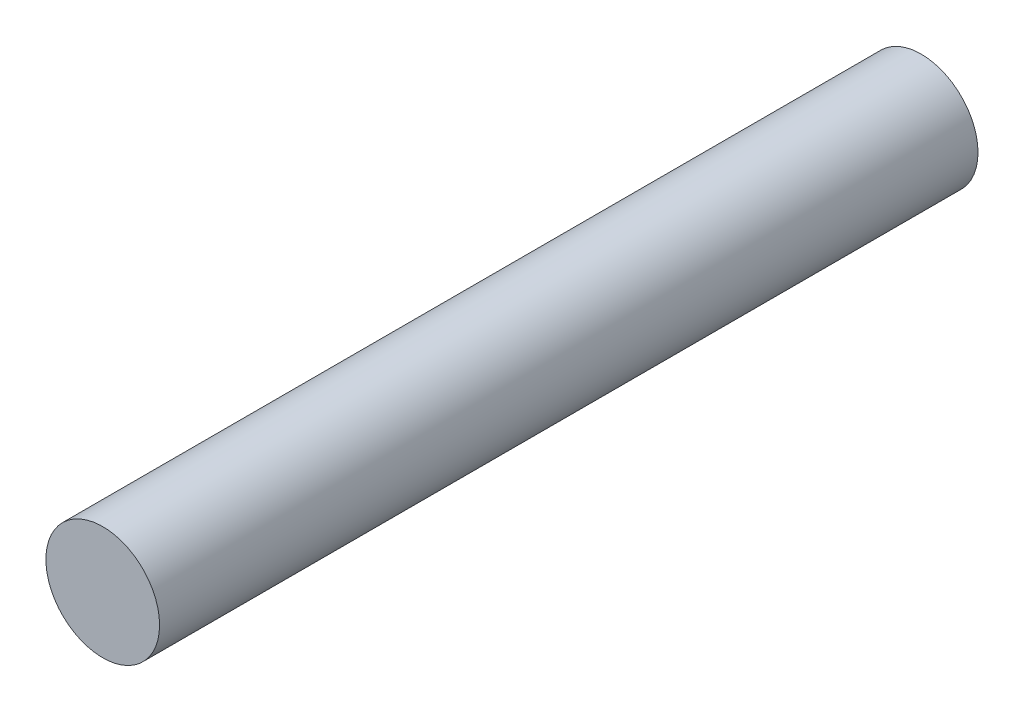
ISO-10303-21;
HEADER;
FILE_DESCRIPTION(('STEP AP214'),'2;1');
FILE_NAME('part.step','',(''),(''),'','','');
FILE_SCHEMA(('AUTOMOTIVE_DESIGN { 1 0 10303 214 1 1 1 1 }'));
ENDSEC;
DATA;
#1=APPLICATION_CONTEXT('core data for automotive mechanical design processes');
#2=APPLICATION_PROTOCOL_DEFINITION('international standard','automotive_design',2000,#1);
#3=PRODUCT_CONTEXT('',#1,'mechanical');
#4=PRODUCT('Part','Part','',(#3));
#5=PRODUCT_RELATED_PRODUCT_CATEGORY('part','',(#4));
#6=PRODUCT_DEFINITION_FORMATION('','',#4);
#7=PRODUCT_DEFINITION_CONTEXT('part definition',#1,'design');
#8=PRODUCT_DEFINITION('design','',#6,#7);
#9=PRODUCT_DEFINITION_SHAPE('','',#8);
#10=(LENGTH_UNIT() NAMED_UNIT(*) SI_UNIT(.MILLI.,.METRE.));
#11=(NAMED_UNIT(*) PLANE_ANGLE_UNIT() SI_UNIT($,.RADIAN.));
#12=(NAMED_UNIT(*) SI_UNIT($,.STERADIAN.) SOLID_ANGLE_UNIT());
#13=UNCERTAINTY_MEASURE_WITH_UNIT(LENGTH_MEASURE(1.E-05),#10,'distance_accuracy_value','');
#14=(GEOMETRIC_REPRESENTATION_CONTEXT(3) GLOBAL_UNCERTAINTY_ASSIGNED_CONTEXT((#13)) GLOBAL_UNIT_ASSIGNED_CONTEXT((#10,
#11,#12)) REPRESENTATION_CONTEXT('',''));
#15=CARTESIAN_POINT('',(0.,0.,0.));
#16=DIRECTION('',(0.,0.,1.));
#17=DIRECTION('',(1.,0.,0.));
#18=AXIS2_PLACEMENT_3D('',#15,#16,#17);
#19=CARTESIAN_POINT('',(0.,0.,72.));
#20=DIRECTION('',(0.,0.,-1.));
#21=DIRECTION('',(-1.,0.,0.));
#22=AXIS2_PLACEMENT_3D('',#19,#20,#21);
#23=CYLINDRICAL_SURFACE('',#22,5.);
#24=CARTESIAN_POINT('',(0.,0.,72.));
#25=DIRECTION('',(0.,0.,1.));
#26=DIRECTION('',(1.,0.,0.));
#27=AXIS2_PLACEMENT_3D('',#24,#25,#26);
#28=CIRCLE('',#27,5.);
#29=CARTESIAN_POINT('',(5.,0.,72.));
#30=VERTEX_POINT('',#29);
#31=EDGE_CURVE('E10',#30,#30,#28,.T.);
#32=ORIENTED_EDGE('',*,*,#31,.F.);
#33=EDGE_LOOP('',(#32));
#34=FACE_BOUND('',#33,.T.);
#35=CARTESIAN_POINT('',(0.,0.,0.));
#36=DIRECTION('',(0.,0.,1.));
#37=DIRECTION('',(1.,0.,0.));
#38=AXIS2_PLACEMENT_3D('',#35,#36,#37);
#39=CIRCLE('',#38,5.);
#40=CARTESIAN_POINT('',(5.,0.,0.));
#41=VERTEX_POINT('',#40);
#42=EDGE_CURVE('E40',#41,#41,#39,.T.);
#43=ORIENTED_EDGE('',*,*,#42,.T.);
#44=EDGE_LOOP('',(#43));
#45=FACE_BOUND('',#44,.T.);
#46=ADVANCED_FACE('F37',(#34,#45),#23,.T.);
#47=CARTESIAN_POINT('',(0.,0.,72.));
#48=DIRECTION('',(0.,0.,1.));
#49=DIRECTION('',(1.,0.,0.));
#50=AXIS2_PLACEMENT_3D('',#47,#48,#49);
#51=PLANE('',#50);
#52=ORIENTED_EDGE('',*,*,#31,.T.);
#53=EDGE_LOOP('',(#52));
#54=FACE_BOUND('',#53,.T.);
#55=ADVANCED_FACE('F54',(#54),#51,.T.);
#56=CARTESIAN_POINT('',(0.,0.,0.));
#57=DIRECTION('',(0.,0.,1.));
#58=DIRECTION('',(1.,0.,0.));
#59=AXIS2_PLACEMENT_3D('',#56,#57,#58);
#60=PLANE('',#59);
#61=ORIENTED_EDGE('',*,*,#42,.F.);
#62=EDGE_LOOP('',(#61));
#63=FACE_BOUND('',#62,.T.);
#64=ADVANCED_FACE('F52',(#63),#60,.F.);
#65=CLOSED_SHELL('',(#46,#55,#64));
#66=MANIFOLD_SOLID_BREP('B2',#65);
#67=ADVANCED_BREP_SHAPE_REPRESENTATION('',(#18,#66),#14);
#68=SHAPE_DEFINITION_REPRESENTATION(#9,#67);
ENDSEC;
END-ISO-10303-21;
